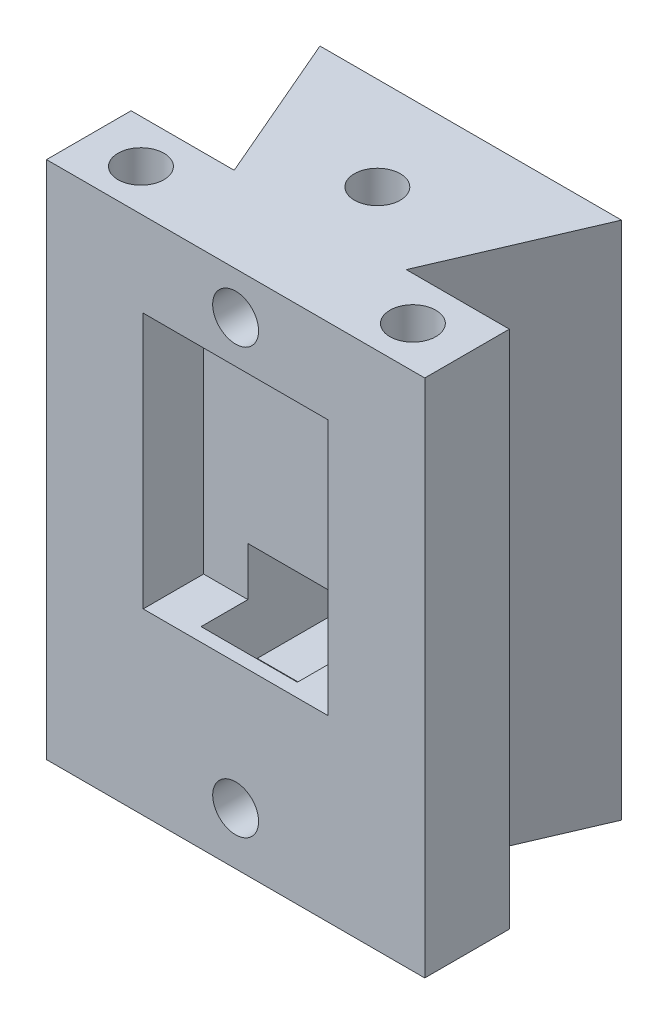
ISO-10303-21;
HEADER;
FILE_DESCRIPTION(('STEP AP214'),'2;1');
FILE_NAME('part.step','',(''),(''),'','','');
FILE_SCHEMA(('AUTOMOTIVE_DESIGN { 1 0 10303 214 1 1 1 1 }'));
ENDSEC;
DATA;
#1=APPLICATION_CONTEXT('core data for automotive mechanical design processes');
#2=APPLICATION_PROTOCOL_DEFINITION('international standard','automotive_design',2000,#1);
#3=PRODUCT_CONTEXT('',#1,'mechanical');
#4=PRODUCT('Part','Part','',(#3));
#5=PRODUCT_RELATED_PRODUCT_CATEGORY('part','',(#4));
#6=PRODUCT_DEFINITION_FORMATION('','',#4);
#7=PRODUCT_DEFINITION_CONTEXT('part definition',#1,'design');
#8=PRODUCT_DEFINITION('design','',#6,#7);
#9=PRODUCT_DEFINITION_SHAPE('','',#8);
#10=(LENGTH_UNIT() NAMED_UNIT(*) SI_UNIT(.MILLI.,.METRE.));
#11=(NAMED_UNIT(*) PLANE_ANGLE_UNIT() SI_UNIT($,.RADIAN.));
#12=(NAMED_UNIT(*) SI_UNIT($,.STERADIAN.) SOLID_ANGLE_UNIT());
#13=UNCERTAINTY_MEASURE_WITH_UNIT(LENGTH_MEASURE(1.E-05),#10,'distance_accuracy_value','');
#14=(GEOMETRIC_REPRESENTATION_CONTEXT(3) GLOBAL_UNCERTAINTY_ASSIGNED_CONTEXT((#13)) GLOBAL_UNIT_ASSIGNED_CONTEXT((#10,
#11,#12)) REPRESENTATION_CONTEXT('',''));
#15=CARTESIAN_POINT('',(0.,0.,0.));
#16=DIRECTION('',(0.,0.,1.));
#17=DIRECTION('',(1.,0.,0.));
#18=AXIS2_PLACEMENT_3D('',#15,#16,#17);
#19=CARTESIAN_POINT('',(0.,0.,0.));
#20=DIRECTION('',(0.,0.,1.));
#21=DIRECTION('',(1.,0.,0.));
#22=AXIS2_PLACEMENT_3D('',#19,#20,#21);
#23=PLANE('',#22);
#24=DIRECTION('',(0.,-1.,0.));
#25=VECTOR('',#24,1.);
#26=CARTESIAN_POINT('',(7.11871400525226,45.4881350240815,0.));
#27=LINE('',#26,#25);
#28=CARTESIAN_POINT('',(7.11871400525227,17.6,0.));
#29=VERTEX_POINT('',#28);
#30=CARTESIAN_POINT('',(7.11871400525227,-25.4,0.));
#31=VERTEX_POINT('',#30);
#32=EDGE_CURVE('E276',#29,#31,#27,.T.);
#33=ORIENTED_EDGE('',*,*,#32,.F.);
#34=DIRECTION('',(-1.,0.,0.));
#35=VECTOR('',#34,1.);
#36=CARTESIAN_POINT('',(-15.65,17.6,0.));
#37=LINE('',#36,#35);
#38=CARTESIAN_POINT('',(15.65,17.6,0.));
#39=VERTEX_POINT('',#38);
#40=EDGE_CURVE('E197',#39,#29,#37,.T.);
#41=ORIENTED_EDGE('',*,*,#40,.F.);
#42=DIRECTION('',(0.,1.,0.));
#43=VECTOR('',#42,1.);
#44=CARTESIAN_POINT('',(15.65,17.6,0.));
#45=LINE('',#44,#43);
#46=CARTESIAN_POINT('',(15.65,-25.4,0.));
#47=VERTEX_POINT('',#46);
#48=EDGE_CURVE('E353',#47,#39,#45,.T.);
#49=ORIENTED_EDGE('',*,*,#48,.F.);
#50=DIRECTION('',(1.,0.,0.));
#51=VECTOR('',#50,1.);
#52=CARTESIAN_POINT('',(7.11871400525227,-25.4,0.));
#53=LINE('',#52,#51);
#54=EDGE_CURVE('E230',#31,#47,#53,.T.);
#55=ORIENTED_EDGE('',*,*,#54,.F.);
#56=EDGE_LOOP('',(#33,#41,#49,#55));
#57=FACE_BOUND('',#56,.T.);
#58=ADVANCED_FACE('F45',(#57),#23,.F.);
#59=CARTESIAN_POINT('',(0.,0.,7.));
#60=DIRECTION('',(0.,0.,1.));
#61=DIRECTION('',(1.,0.,0.));
#62=AXIS2_PLACEMENT_3D('',#59,#60,#61);
#63=PLANE('',#62);
#64=CARTESIAN_POINT('',(0.,-21.0631013938427,7.));
#65=DIRECTION('',(0.,0.,1.));
#66=DIRECTION('',(1.,0.,0.));
#67=AXIS2_PLACEMENT_3D('',#64,#65,#66);
#68=CIRCLE('',#67,1.9);
#69=CARTESIAN_POINT('',(-1.89999999999999,-21.0631013938427,7.));
#70=VERTEX_POINT('',#69);
#71=EDGE_CURVE('E359',#70,#70,#68,.F.);
#72=ORIENTED_EDGE('',*,*,#71,.T.);
#73=EDGE_LOOP('',(#72));
#74=FACE_BOUND('',#73,.T.);
#75=CARTESIAN_POINT('',(0.,14.1,7.));
#76=DIRECTION('',(0.,0.,1.));
#77=DIRECTION('',(1.,0.,0.));
#78=AXIS2_PLACEMENT_3D('',#75,#76,#77);
#79=CIRCLE('',#78,1.9);
#80=CARTESIAN_POINT('',(1.9,14.1,7.));
#81=VERTEX_POINT('',#80);
#82=EDGE_CURVE('E262',#81,#81,#79,.T.);
#83=ORIENTED_EDGE('',*,*,#82,.F.);
#84=EDGE_LOOP('',(#83));
#85=FACE_BOUND('',#84,.T.);
#86=DIRECTION('',(0.,-1.,0.));
#87=VECTOR('',#86,1.);
#88=CARTESIAN_POINT('',(-15.65,17.6,7.));
#89=LINE('',#88,#87);
#90=CARTESIAN_POINT('',(-15.65,17.6,7.));
#91=VERTEX_POINT('',#90);
#92=CARTESIAN_POINT('',(-15.65,-25.4,7.));
#93=VERTEX_POINT('',#92);
#94=EDGE_CURVE('E185',#91,#93,#89,.T.);
#95=ORIENTED_EDGE('',*,*,#94,.T.);
#96=DIRECTION('',(-1.,0.,0.));
#97=VECTOR('',#96,1.);
#98=CARTESIAN_POINT('',(-15.65,-25.4,7.));
#99=LINE('',#98,#97);
#100=CARTESIAN_POINT('',(15.65,-25.4,7.));
#101=VERTEX_POINT('',#100);
#102=EDGE_CURVE('E190',#101,#93,#99,.T.);
#103=ORIENTED_EDGE('',*,*,#102,.F.);
#104=DIRECTION('',(0.,1.,0.));
#105=VECTOR('',#104,1.);
#106=CARTESIAN_POINT('',(15.65,17.6,7.));
#107=LINE('',#106,#105);
#108=CARTESIAN_POINT('',(15.65,17.6,7.));
#109=VERTEX_POINT('',#108);
#110=EDGE_CURVE('E196',#101,#109,#107,.T.);
#111=ORIENTED_EDGE('',*,*,#110,.T.);
#112=DIRECTION('',(-1.,0.,0.));
#113=VECTOR('',#112,1.);
#114=CARTESIAN_POINT('',(-15.65,17.6,7.));
#115=LINE('',#114,#113);
#116=EDGE_CURVE('E192',#109,#91,#115,.T.);
#117=ORIENTED_EDGE('',*,*,#116,.T.);
#118=EDGE_LOOP('',(#95,#103,#111,#117));
#119=FACE_BOUND('',#118,.T.);
#120=DIRECTION('',(-1.,0.,0.));
#121=VECTOR('',#120,1.);
#122=CARTESIAN_POINT('',(-7.65,10.6,7.));
#123=LINE('',#122,#121);
#124=CARTESIAN_POINT('',(7.65,10.6,7.));
#125=VERTEX_POINT('',#124);
#126=CARTESIAN_POINT('',(-7.65,10.6,7.));
#127=VERTEX_POINT('',#126);
#128=EDGE_CURVE('E330',#125,#127,#123,.T.);
#129=ORIENTED_EDGE('',*,*,#128,.F.);
#130=DIRECTION('',(0.,1.,0.));
#131=VECTOR('',#130,1.);
#132=CARTESIAN_POINT('',(7.65,10.6,7.));
#133=LINE('',#132,#131);
#134=CARTESIAN_POINT('',(7.65,-10.6,7.));
#135=VERTEX_POINT('',#134);
#136=EDGE_CURVE('E328',#135,#125,#133,.T.);
#137=ORIENTED_EDGE('',*,*,#136,.F.);
#138=DIRECTION('',(1.,0.,0.));
#139=VECTOR('',#138,1.);
#140=CARTESIAN_POINT('',(-7.65,-10.6,7.));
#141=LINE('',#140,#139);
#142=CARTESIAN_POINT('',(-7.65,-10.6,7.));
#143=VERTEX_POINT('',#142);
#144=EDGE_CURVE('E335',#143,#135,#141,.T.);
#145=ORIENTED_EDGE('',*,*,#144,.F.);
#146=DIRECTION('',(0.,-1.,0.));
#147=VECTOR('',#146,1.);
#148=CARTESIAN_POINT('',(-7.65,10.6,7.));
#149=LINE('',#148,#147);
#150=EDGE_CURVE('E332',#127,#143,#149,.T.);
#151=ORIENTED_EDGE('',*,*,#150,.F.);
#152=EDGE_LOOP('',(#129,#137,#145,#151));
#153=FACE_BOUND('',#152,.T.);
#154=ADVANCED_FACE('F187',(#74,#85,#119,#153),#63,.T.);
#155=CARTESIAN_POINT('',(-7.11871400525227,17.6,0.));
#156=VERTEX_POINT('',#155);
#157=CARTESIAN_POINT('',(-15.65,17.6,0.));
#158=VERTEX_POINT('',#157);
#159=EDGE_CURVE('E70',#156,#158,#37,.T.);
#160=ORIENTED_EDGE('',*,*,#159,.F.);
#161=DIRECTION('',(0.,-1.,0.));
#162=VECTOR('',#161,1.);
#163=CARTESIAN_POINT('',(-7.11871400525227,45.4881350240815,0.));
#164=LINE('',#163,#162);
#165=CARTESIAN_POINT('',(-7.11871400525227,-25.4,0.));
#166=VERTEX_POINT('',#165);
#167=EDGE_CURVE('E272',#156,#166,#164,.T.);
#168=ORIENTED_EDGE('',*,*,#167,.T.);
#169=DIRECTION('',(1.,0.,0.));
#170=VECTOR('',#169,1.);
#171=CARTESIAN_POINT('',(-15.65,-25.4,0.));
#172=LINE('',#171,#170);
#173=CARTESIAN_POINT('',(-15.65,-25.4,0.));
#174=VERTEX_POINT('',#173);
#175=EDGE_CURVE('E205',#174,#166,#172,.T.);
#176=ORIENTED_EDGE('',*,*,#175,.F.);
#177=DIRECTION('',(0.,-1.,0.));
#178=VECTOR('',#177,1.);
#179=CARTESIAN_POINT('',(-15.65,17.6,0.));
#180=LINE('',#179,#178);
#181=EDGE_CURVE('E201',#158,#174,#180,.T.);
#182=ORIENTED_EDGE('',*,*,#181,.F.);
#183=EDGE_LOOP('',(#160,#168,#176,#182));
#184=FACE_BOUND('',#183,.T.);
#185=ADVANCED_FACE('F413',(#184),#23,.F.);
#186=CARTESIAN_POINT('',(-15.65,17.6,7.));
#187=DIRECTION('',(1.,0.,0.));
#188=DIRECTION('',(0.,1.,0.));
#189=AXIS2_PLACEMENT_3D('',#186,#187,#188);
#190=PLANE('',#189);
#191=ORIENTED_EDGE('',*,*,#181,.T.);
#192=DIRECTION('',(0.,0.,-1.));
#193=VECTOR('',#192,1.);
#194=CARTESIAN_POINT('',(-15.65,-25.4,7.));
#195=LINE('',#194,#193);
#196=EDGE_CURVE('E200',#93,#174,#195,.T.);
#197=ORIENTED_EDGE('',*,*,#196,.F.);
#198=ORIENTED_EDGE('',*,*,#94,.F.);
#199=DIRECTION('',(0.,0.,-1.));
#200=VECTOR('',#199,1.);
#201=CARTESIAN_POINT('',(-15.65,17.6,7.));
#202=LINE('',#201,#200);
#203=EDGE_CURVE('E351',#91,#158,#202,.T.);
#204=ORIENTED_EDGE('',*,*,#203,.T.);
#205=EDGE_LOOP('',(#191,#197,#198,#204));
#206=FACE_BOUND('',#205,.T.);
#207=ADVANCED_FACE('F47',(#206),#190,.F.);
#208=CARTESIAN_POINT('',(15.65,17.6,7.));
#209=DIRECTION('',(-1.,0.,0.));
#210=DIRECTION('',(0.,-1.,0.));
#211=AXIS2_PLACEMENT_3D('',#208,#209,#210);
#212=PLANE('',#211);
#213=ORIENTED_EDGE('',*,*,#48,.T.);
#214=DIRECTION('',(0.,0.,-1.));
#215=VECTOR('',#214,1.);
#216=CARTESIAN_POINT('',(15.65,17.6,7.));
#217=LINE('',#216,#215);
#218=EDGE_CURVE('E54',#109,#39,#217,.T.);
#219=ORIENTED_EDGE('',*,*,#218,.F.);
#220=ORIENTED_EDGE('',*,*,#110,.F.);
#221=DIRECTION('',(0.,0.,1.));
#222=VECTOR('',#221,1.);
#223=CARTESIAN_POINT('',(15.65,-25.4,0.));
#224=LINE('',#223,#222);
#225=EDGE_CURVE('E212',#47,#101,#224,.T.);
#226=ORIENTED_EDGE('',*,*,#225,.F.);
#227=EDGE_LOOP('',(#213,#219,#220,#226));
#228=FACE_BOUND('',#227,.T.);
#229=ADVANCED_FACE('F424',(#228),#212,.F.);
#230=CARTESIAN_POINT('',(-15.65,17.6,7.));
#231=DIRECTION('',(0.,-1.,0.));
#232=DIRECTION('',(1.,0.,0.));
#233=AXIS2_PLACEMENT_3D('',#230,#231,#232);
#234=PLANE('',#233);
#235=CARTESIAN_POINT('',(0.,17.6,-4.72724866744241));
#236=DIRECTION('',(0.,-1.,0.));
#237=DIRECTION('',(1.,0.,0.));
#238=AXIS2_PLACEMENT_3D('',#235,#236,#237);
#239=CIRCLE('',#238,1.9);
#240=CARTESIAN_POINT('',(1.90000000000001,17.6,-4.72724866744241));
#241=VERTEX_POINT('',#240);
#242=EDGE_CURVE('E376',#241,#241,#239,.T.);
#243=ORIENTED_EDGE('',*,*,#242,.T.);
#244=EDGE_LOOP('',(#243));
#245=FACE_BOUND('',#244,.T.);
#246=CARTESIAN_POINT('',(-11.25,17.6,3.58335785592832));
#247=DIRECTION('',(0.,-1.,0.));
#248=DIRECTION('',(1.,0.,0.));
#249=AXIS2_PLACEMENT_3D('',#246,#247,#248);
#250=CIRCLE('',#249,1.9);
#251=CARTESIAN_POINT('',(-9.35,17.6,3.58335785592832));
#252=VERTEX_POINT('',#251);
#253=EDGE_CURVE('E283',#252,#252,#250,.T.);
#254=ORIENTED_EDGE('',*,*,#253,.T.);
#255=EDGE_LOOP('',(#254));
#256=FACE_BOUND('',#255,.T.);
#257=CARTESIAN_POINT('',(11.25,17.6,3.58335785592832));
#258=DIRECTION('',(0.,-1.,0.));
#259=DIRECTION('',(-1.,0.,0.));
#260=AXIS2_PLACEMENT_3D('',#257,#258,#259);
#261=CIRCLE('',#260,1.9);
#262=CARTESIAN_POINT('',(9.35,17.6,3.58335785592832));
#263=VERTEX_POINT('',#262);
#264=EDGE_CURVE('E282',#263,#263,#261,.T.);
#265=ORIENTED_EDGE('',*,*,#264,.T.);
#266=EDGE_LOOP('',(#265));
#267=FACE_BOUND('',#266,.T.);
#268=ORIENTED_EDGE('',*,*,#40,.T.);
#269=DIRECTION('',(0.3951913076483,0.,-0.918598840821839));
#270=VECTOR('',#269,1.);
#271=CARTESIAN_POINT('',(12.4764829671,17.6,-12.4538173347795));
#272=LINE('',#271,#270);
#273=CARTESIAN_POINT('',(12.4764829671,17.6,-12.4538173347795));
#274=VERTEX_POINT('',#273);
#275=EDGE_CURVE('E269',#29,#274,#272,.T.);
#276=ORIENTED_EDGE('',*,*,#275,.T.);
#277=DIRECTION('',(-1.,0.,0.));
#278=VECTOR('',#277,1.);
#279=CARTESIAN_POINT('',(-12.4764829671,17.6,-12.4538173347795));
#280=LINE('',#279,#278);
#281=CARTESIAN_POINT('',(-12.4764829671,17.6,-12.4538173347795));
#282=VERTEX_POINT('',#281);
#283=EDGE_CURVE('E274',#274,#282,#280,.T.);
#284=ORIENTED_EDGE('',*,*,#283,.T.);
#285=DIRECTION('',(0.3951913076483,0.,0.918598840821839));
#286=VECTOR('',#285,1.);
#287=CARTESIAN_POINT('',(-7.11871400525227,17.6,0.));
#288=LINE('',#287,#286);
#289=EDGE_CURVE('E271',#282,#156,#288,.T.);
#290=ORIENTED_EDGE('',*,*,#289,.T.);
#291=ORIENTED_EDGE('',*,*,#159,.T.);
#292=ORIENTED_EDGE('',*,*,#203,.F.);
#293=ORIENTED_EDGE('',*,*,#116,.F.);
#294=ORIENTED_EDGE('',*,*,#218,.T.);
#295=EDGE_LOOP('',(#268,#276,#284,#290,#291,#292,#293,#294));
#296=FACE_BOUND('',#295,.T.);
#297=ADVANCED_FACE('F428',(#245,#256,#267,#296),#234,.F.);
#298=CARTESIAN_POINT('',(7.65,10.6,7.));
#299=DIRECTION('',(-1.,0.,0.));
#300=DIRECTION('',(0.,-1.,0.));
#301=AXIS2_PLACEMENT_3D('',#298,#299,#300);
#302=PLANE('',#301);
#303=DIRECTION('',(0.,-1.,0.));
#304=VECTOR('',#303,1.);
#305=CARTESIAN_POINT('',(7.65,0.,2.));
#306=LINE('',#305,#304);
#307=CARTESIAN_POINT('',(7.65,10.6,2.));
#308=VERTEX_POINT('',#307);
#309=CARTESIAN_POINT('',(7.65,-10.6,2.));
#310=VERTEX_POINT('',#309);
#311=EDGE_CURVE('E316',#308,#310,#306,.T.);
#312=ORIENTED_EDGE('',*,*,#311,.T.);
#313=DIRECTION('',(0.,0.,-1.));
#314=VECTOR('',#313,1.);
#315=CARTESIAN_POINT('',(7.65,-10.6,7.));
#316=LINE('',#315,#314);
#317=EDGE_CURVE('E337',#135,#310,#316,.T.);
#318=ORIENTED_EDGE('',*,*,#317,.F.);
#319=ORIENTED_EDGE('',*,*,#136,.T.);
#320=DIRECTION('',(0.,0.,-1.));
#321=VECTOR('',#320,1.);
#322=CARTESIAN_POINT('',(7.65,10.6,7.));
#323=LINE('',#322,#321);
#324=EDGE_CURVE('E346',#125,#308,#323,.T.);
#325=ORIENTED_EDGE('',*,*,#324,.T.);
#326=EDGE_LOOP('',(#312,#318,#319,#325));
#327=FACE_BOUND('',#326,.T.);
#328=ADVANCED_FACE('F434',(#327),#302,.T.);
#329=CARTESIAN_POINT('',(-7.65,10.6,7.));
#330=DIRECTION('',(0.,-1.,0.));
#331=DIRECTION('',(0.,0.,-1.));
#332=AXIS2_PLACEMENT_3D('',#329,#330,#331);
#333=PLANE('',#332);
#334=DIRECTION('',(1.,0.,0.));
#335=VECTOR('',#334,1.);
#336=CARTESIAN_POINT('',(0.,10.6,2.));
#337=LINE('',#336,#335);
#338=CARTESIAN_POINT('',(-7.65,10.6,2.));
#339=VERTEX_POINT('',#338);
#340=EDGE_CURVE('E319',#339,#308,#337,.T.);
#341=ORIENTED_EDGE('',*,*,#340,.T.);
#342=ORIENTED_EDGE('',*,*,#324,.F.);
#343=ORIENTED_EDGE('',*,*,#128,.T.);
#344=DIRECTION('',(0.,0.,-1.));
#345=VECTOR('',#344,1.);
#346=CARTESIAN_POINT('',(-7.65,10.6,7.));
#347=LINE('',#346,#345);
#348=EDGE_CURVE('E343',#127,#339,#347,.T.);
#349=ORIENTED_EDGE('',*,*,#348,.T.);
#350=EDGE_LOOP('',(#341,#342,#343,#349));
#351=FACE_BOUND('',#350,.T.);
#352=ADVANCED_FACE('F527',(#351),#333,.T.);
#353=CARTESIAN_POINT('',(-7.65,10.6,7.));
#354=DIRECTION('',(1.,0.,0.));
#355=DIRECTION('',(0.,1.,0.));
#356=AXIS2_PLACEMENT_3D('',#353,#354,#355);
#357=PLANE('',#356);
#358=DIRECTION('',(0.,-1.,0.));
#359=VECTOR('',#358,1.);
#360=CARTESIAN_POINT('',(-7.65,0.,2.));
#361=LINE('',#360,#359);
#362=CARTESIAN_POINT('',(-7.65,-10.6,2.));
#363=VERTEX_POINT('',#362);
#364=EDGE_CURVE('E321',#339,#363,#361,.T.);
#365=ORIENTED_EDGE('',*,*,#364,.F.);
#366=ORIENTED_EDGE('',*,*,#348,.F.);
#367=ORIENTED_EDGE('',*,*,#150,.T.);
#368=DIRECTION('',(0.,0.,-1.));
#369=VECTOR('',#368,1.);
#370=CARTESIAN_POINT('',(-7.65,-10.6,7.));
#371=LINE('',#370,#369);
#372=EDGE_CURVE('E340',#143,#363,#371,.T.);
#373=ORIENTED_EDGE('',*,*,#372,.T.);
#374=EDGE_LOOP('',(#365,#366,#367,#373));
#375=FACE_BOUND('',#374,.T.);
#376=ADVANCED_FACE('F532',(#375),#357,.T.);
#377=CARTESIAN_POINT('',(-7.65,-10.6,7.));
#378=DIRECTION('',(0.,1.,0.));
#379=DIRECTION('',(0.,0.,1.));
#380=AXIS2_PLACEMENT_3D('',#377,#378,#379);
#381=PLANE('',#380);
#382=DIRECTION('',(0.,0.,1.));
#383=VECTOR('',#382,1.);
#384=CARTESIAN_POINT('',(-3.9855117917816,-10.6,1.22392079916793));
#385=LINE('',#384,#383);
#386=CARTESIAN_POINT('',(-3.9855117917816,-10.6,2.));
#387=VERTEX_POINT('',#386);
#388=CARTESIAN_POINT('',(-3.9855117917816,-10.6,5.87257780316096));
#389=VERTEX_POINT('',#388);
#390=EDGE_CURVE('E286',#387,#389,#385,.T.);
#391=ORIENTED_EDGE('',*,*,#390,.F.);
#392=DIRECTION('',(1.,0.,0.));
#393=VECTOR('',#392,1.);
#394=CARTESIAN_POINT('',(0.,-10.6,2.));
#395=LINE('',#394,#393);
#396=EDGE_CURVE('E325',#363,#387,#395,.T.);
#397=ORIENTED_EDGE('',*,*,#396,.F.);
#398=ORIENTED_EDGE('',*,*,#372,.F.);
#399=ORIENTED_EDGE('',*,*,#144,.T.);
#400=ORIENTED_EDGE('',*,*,#317,.T.);
#401=CARTESIAN_POINT('',(3.9855117917816,-10.6,2.));
#402=VERTEX_POINT('',#401);
#403=EDGE_CURVE('E324',#402,#310,#395,.T.);
#404=ORIENTED_EDGE('',*,*,#403,.F.);
#405=DIRECTION('',(0.,0.,-1.));
#406=VECTOR('',#405,1.);
#407=CARTESIAN_POINT('',(3.9855117917816,-10.6,1.22392079916793));
#408=LINE('',#407,#406);
#409=CARTESIAN_POINT('',(3.9855117917816,-10.6,5.87257780316096));
#410=VERTEX_POINT('',#409);
#411=EDGE_CURVE('E294',#410,#402,#408,.T.);
#412=ORIENTED_EDGE('',*,*,#411,.F.);
#413=DIRECTION('',(1.,0.,0.));
#414=VECTOR('',#413,1.);
#415=CARTESIAN_POINT('',(-3.9855117917816,-10.6,5.87257780316096));
#416=LINE('',#415,#414);
#417=EDGE_CURVE('E291',#389,#410,#416,.T.);
#418=ORIENTED_EDGE('',*,*,#417,.F.);
#419=EDGE_LOOP('',(#391,#397,#398,#399,#400,#404,#412,#418));
#420=FACE_BOUND('',#419,.T.);
#421=ADVANCED_FACE('F507',(#420),#381,.T.);
#422=CARTESIAN_POINT('',(0.,0.,2.));
#423=DIRECTION('',(0.,0.,1.));
#424=DIRECTION('',(1.,0.,0.));
#425=AXIS2_PLACEMENT_3D('',#422,#423,#424);
#426=PLANE('',#425);
#427=DIRECTION('',(0.,-1.,0.));
#428=VECTOR('',#427,1.);
#429=CARTESIAN_POINT('',(-3.9855117917816,-15.2006783387731,2.));
#430=LINE('',#429,#428);
#431=CARTESIAN_POINT('',(-3.9855117917816,-6.57673894372647,2.));
#432=VERTEX_POINT('',#431);
#433=EDGE_CURVE('E233',#432,#387,#430,.T.);
#434=ORIENTED_EDGE('',*,*,#433,.F.);
#435=DIRECTION('',(-1.,0.,0.));
#436=VECTOR('',#435,1.);
#437=CARTESIAN_POINT('',(-3.9855117917816,-6.57673894372647,2.));
#438=LINE('',#437,#436);
#439=CARTESIAN_POINT('',(3.9855117917816,-6.57673894372647,2.));
#440=VERTEX_POINT('',#439);
#441=EDGE_CURVE('E238',#440,#432,#438,.T.);
#442=ORIENTED_EDGE('',*,*,#441,.F.);
#443=DIRECTION('',(0.,1.,0.));
#444=VECTOR('',#443,1.);
#445=CARTESIAN_POINT('',(3.9855117917816,-15.2006783387731,2.));
#446=LINE('',#445,#444);
#447=EDGE_CURVE('E247',#402,#440,#446,.T.);
#448=ORIENTED_EDGE('',*,*,#447,.F.);
#449=ORIENTED_EDGE('',*,*,#403,.T.);
#450=ORIENTED_EDGE('',*,*,#311,.F.);
#451=ORIENTED_EDGE('',*,*,#340,.F.);
#452=ORIENTED_EDGE('',*,*,#364,.T.);
#453=ORIENTED_EDGE('',*,*,#396,.T.);
#454=EDGE_LOOP('',(#434,#442,#448,#449,#450,#451,#452,#453));
#455=FACE_BOUND('',#454,.T.);
#456=ADVANCED_FACE('F500',(#455),#426,.T.);
#457=CARTESIAN_POINT('',(-3.9855117917816,-17.6,1.22392079916793));
#458=DIRECTION('',(0.,0.,-1.));
#459=DIRECTION('',(-1.,0.,0.));
#460=AXIS2_PLACEMENT_3D('',#457,#458,#459);
#461=PLANE('',#460);
#462=DIRECTION('',(0.,1.,0.));
#463=VECTOR('',#462,1.);
#464=CARTESIAN_POINT('',(3.9855117917816,-17.6,1.22392079916793));
#465=LINE('',#464,#463);
#466=CARTESIAN_POINT('',(3.9855117917816,-16.6,1.22392079916793));
#467=VERTEX_POINT('',#466);
#468=CARTESIAN_POINT('',(3.9855117917816,-15.2006783387731,1.22392079916793));
#469=VERTEX_POINT('',#468);
#470=EDGE_CURVE('E302',#467,#469,#465,.T.);
#471=ORIENTED_EDGE('',*,*,#470,.T.);
#472=DIRECTION('',(-1.,0.,0.));
#473=VECTOR('',#472,1.);
#474=CARTESIAN_POINT('',(-3.9855117917816,-15.2006783387731,1.22392079916793));
#475=LINE('',#474,#473);
#476=CARTESIAN_POINT('',(-3.9855117917816,-15.2006783387731,1.22392079916793));
#477=VERTEX_POINT('',#476);
#478=EDGE_CURVE('E253',#469,#477,#475,.T.);
#479=ORIENTED_EDGE('',*,*,#478,.T.);
#480=DIRECTION('',(0.,1.,0.));
#481=VECTOR('',#480,1.);
#482=CARTESIAN_POINT('',(-3.9855117917816,-17.6,1.22392079916793));
#483=LINE('',#482,#481);
#484=CARTESIAN_POINT('',(-3.9855117917816,-16.6,1.22392079916793));
#485=VERTEX_POINT('',#484);
#486=EDGE_CURVE('E298',#485,#477,#483,.T.);
#487=ORIENTED_EDGE('',*,*,#486,.F.);
#488=DIRECTION('',(-1.,0.,0.));
#489=VECTOR('',#488,1.);
#490=CARTESIAN_POINT('',(-15.65,-16.6,1.22392079916793));
#491=LINE('',#490,#489);
#492=EDGE_CURVE('E12',#467,#485,#491,.T.);
#493=ORIENTED_EDGE('',*,*,#492,.F.);
#494=EDGE_LOOP('',(#471,#479,#487,#493));
#495=FACE_BOUND('',#494,.T.);
#496=ADVANCED_FACE('F515',(#495),#461,.F.);
#497=CARTESIAN_POINT('',(-3.9855117917816,-17.6,1.22392079916793));
#498=DIRECTION('',(-1.,0.,0.));
#499=DIRECTION('',(0.,0.,1.));
#500=AXIS2_PLACEMENT_3D('',#497,#498,#499);
#501=PLANE('',#500);
#502=ORIENTED_EDGE('',*,*,#486,.T.);
#503=DIRECTION('',(0.,0.,1.));
#504=VECTOR('',#503,1.);
#505=CARTESIAN_POINT('',(-3.9855117917816,-15.2006783387731,-12.4538173347795));
#506=LINE('',#505,#504);
#507=CARTESIAN_POINT('',(-3.9855117917816,-15.2006783387731,-12.4538173347795));
#508=VERTEX_POINT('',#507);
#509=EDGE_CURVE('E245',#508,#477,#506,.T.);
#510=ORIENTED_EDGE('',*,*,#509,.F.);
#511=DIRECTION('',(0.,-1.,0.));
#512=VECTOR('',#511,1.);
#513=CARTESIAN_POINT('',(-3.9855117917816,-15.2006783387731,-12.4538173347795));
#514=LINE('',#513,#512);
#515=CARTESIAN_POINT('',(-3.9855117917816,-6.57673894372647,-12.4538173347795));
#516=VERTEX_POINT('',#515);
#517=EDGE_CURVE('E234',#516,#508,#514,.T.);
#518=ORIENTED_EDGE('',*,*,#517,.F.);
#519=DIRECTION('',(0.,0.,1.));
#520=VECTOR('',#519,1.);
#521=CARTESIAN_POINT('',(-3.9855117917816,-6.57673894372647,-12.4538173347795));
#522=LINE('',#521,#520);
#523=EDGE_CURVE('E251',#516,#432,#522,.T.);
#524=ORIENTED_EDGE('',*,*,#523,.T.);
#525=ORIENTED_EDGE('',*,*,#433,.T.);
#526=ORIENTED_EDGE('',*,*,#390,.T.);
#527=DIRECTION('',(0.,1.,0.));
#528=VECTOR('',#527,1.);
#529=CARTESIAN_POINT('',(-3.9855117917816,-17.6,5.87257780316096));
#530=LINE('',#529,#528);
#531=CARTESIAN_POINT('',(-3.9855117917816,-16.6,5.87257780316096));
#532=VERTEX_POINT('',#531);
#533=EDGE_CURVE('E297',#532,#389,#530,.T.);
#534=ORIENTED_EDGE('',*,*,#533,.F.);
#535=DIRECTION('',(0.,0.,1.));
#536=VECTOR('',#535,1.);
#537=CARTESIAN_POINT('',(-3.9855117917816,-16.6,7.));
#538=LINE('',#537,#536);
#539=EDGE_CURVE('E313',#485,#532,#538,.T.);
#540=ORIENTED_EDGE('',*,*,#539,.F.);
#541=EDGE_LOOP('',(#502,#510,#518,#524,#525,#526,#534,#540));
#542=FACE_BOUND('',#541,.T.);
#543=ADVANCED_FACE('F503',(#542),#501,.F.);
#544=CARTESIAN_POINT('',(3.9855117917816,-17.6,1.22392079916793));
#545=DIRECTION('',(1.,0.,0.));
#546=DIRECTION('',(0.,0.,-1.));
#547=AXIS2_PLACEMENT_3D('',#544,#545,#546);
#548=PLANE('',#547);
#549=DIRECTION('',(0.,0.,1.));
#550=VECTOR('',#549,1.);
#551=CARTESIAN_POINT('',(3.9855117917816,-15.2006783387731,-12.4538173347795));
#552=LINE('',#551,#550);
#553=CARTESIAN_POINT('',(3.9855117917816,-15.2006783387731,-12.4538173347795));
#554=VERTEX_POINT('',#553);
#555=EDGE_CURVE('E257',#554,#469,#552,.T.);
#556=ORIENTED_EDGE('',*,*,#555,.T.);
#557=ORIENTED_EDGE('',*,*,#470,.F.);
#558=DIRECTION('',(0.,0.,-1.));
#559=VECTOR('',#558,1.);
#560=CARTESIAN_POINT('',(3.9855117917816,-16.6,7.));
#561=LINE('',#560,#559);
#562=CARTESIAN_POINT('',(3.9855117917816,-16.6,5.87257780316096));
#563=VERTEX_POINT('',#562);
#564=EDGE_CURVE('E310',#563,#467,#561,.T.);
#565=ORIENTED_EDGE('',*,*,#564,.F.);
#566=DIRECTION('',(0.,1.,0.));
#567=VECTOR('',#566,1.);
#568=CARTESIAN_POINT('',(3.9855117917816,-17.6,5.87257780316096));
#569=LINE('',#568,#567);
#570=EDGE_CURVE('E305',#563,#410,#569,.T.);
#571=ORIENTED_EDGE('',*,*,#570,.T.);
#572=ORIENTED_EDGE('',*,*,#411,.T.);
#573=ORIENTED_EDGE('',*,*,#447,.T.);
#574=DIRECTION('',(0.,0.,1.));
#575=VECTOR('',#574,1.);
#576=CARTESIAN_POINT('',(3.9855117917816,-6.57673894372647,-12.4538173347795));
#577=LINE('',#576,#575);
#578=CARTESIAN_POINT('',(3.9855117917816,-6.57673894372647,-12.4538173347795));
#579=VERTEX_POINT('',#578);
#580=EDGE_CURVE('E254',#579,#440,#577,.T.);
#581=ORIENTED_EDGE('',*,*,#580,.F.);
#582=DIRECTION('',(0.,1.,0.));
#583=VECTOR('',#582,1.);
#584=CARTESIAN_POINT('',(3.9855117917816,-15.2006783387731,-12.4538173347795));
#585=LINE('',#584,#583);
#586=EDGE_CURVE('E62',#554,#579,#585,.T.);
#587=ORIENTED_EDGE('',*,*,#586,.F.);
#588=EDGE_LOOP('',(#556,#557,#565,#571,#572,#573,#581,#587));
#589=FACE_BOUND('',#588,.T.);
#590=ADVANCED_FACE('F518',(#589),#548,.F.);
#591=CARTESIAN_POINT('',(-3.9855117917816,-17.6,5.87257780316096));
#592=DIRECTION('',(0.,0.,1.));
#593=DIRECTION('',(1.,0.,0.));
#594=AXIS2_PLACEMENT_3D('',#591,#592,#593);
#595=PLANE('',#594);
#596=ORIENTED_EDGE('',*,*,#533,.T.);
#597=ORIENTED_EDGE('',*,*,#417,.T.);
#598=ORIENTED_EDGE('',*,*,#570,.F.);
#599=DIRECTION('',(1.,0.,0.));
#600=VECTOR('',#599,1.);
#601=CARTESIAN_POINT('',(-15.65,-16.6,5.87257780316096));
#602=LINE('',#601,#600);
#603=EDGE_CURVE('E301',#532,#563,#602,.T.);
#604=ORIENTED_EDGE('',*,*,#603,.F.);
#605=EDGE_LOOP('',(#596,#597,#598,#604));
#606=FACE_BOUND('',#605,.T.);
#607=ADVANCED_FACE('F406',(#606),#595,.F.);
#608=CARTESIAN_POINT('',(11.25,17.6,3.58335785592832));
#609=DIRECTION('',(0.,-1.,0.));
#610=DIRECTION('',(1.,0.,0.));
#611=AXIS2_PLACEMENT_3D('',#608,#609,#610);
#612=CYLINDRICAL_SURFACE('',#611,1.9);
#613=ORIENTED_EDGE('',*,*,#264,.F.);
#614=EDGE_LOOP('',(#613));
#615=FACE_BOUND('',#614,.T.);
#616=CARTESIAN_POINT('',(11.25,-25.4,3.58335785592832));
#617=DIRECTION('',(0.,-1.,0.));
#618=DIRECTION('',(1.,0.,0.));
#619=AXIS2_PLACEMENT_3D('',#616,#617,#618);
#620=CIRCLE('',#619,1.9);
#621=CARTESIAN_POINT('',(13.15,-25.4,3.58335785592832));
#622=VERTEX_POINT('',#621);
#623=EDGE_CURVE('E216',#622,#622,#620,.T.);
#624=ORIENTED_EDGE('',*,*,#623,.T.);
#625=EDGE_LOOP('',(#624));
#626=FACE_BOUND('',#625,.T.);
#627=ADVANCED_FACE('F396',(#615,#626),#612,.F.);
#628=CARTESIAN_POINT('',(-11.25,17.6,3.58335785592832));
#629=DIRECTION('',(0.,-1.,0.));
#630=DIRECTION('',(1.,0.,0.));
#631=AXIS2_PLACEMENT_3D('',#628,#629,#630);
#632=CYLINDRICAL_SURFACE('',#631,1.9);
#633=ORIENTED_EDGE('',*,*,#253,.F.);
#634=EDGE_LOOP('',(#633));
#635=FACE_BOUND('',#634,.T.);
#636=CARTESIAN_POINT('',(-11.25,-25.4,3.58335785592832));
#637=DIRECTION('',(0.,-1.,0.));
#638=DIRECTION('',(1.,0.,0.));
#639=AXIS2_PLACEMENT_3D('',#636,#637,#638);
#640=CIRCLE('',#639,1.9);
#641=CARTESIAN_POINT('',(-9.35,-25.4,3.58335785592832));
#642=VERTEX_POINT('',#641);
#643=EDGE_CURVE('E213',#642,#642,#640,.T.);
#644=ORIENTED_EDGE('',*,*,#643,.T.);
#645=EDGE_LOOP('',(#644));
#646=FACE_BOUND('',#645,.T.);
#647=ADVANCED_FACE('F393',(#635,#646),#632,.F.);
#648=CARTESIAN_POINT('',(-7.11871400525227,45.4881350240815,0.));
#649=DIRECTION('',(-0.918598840821839,0.,0.3951913076483));
#650=DIRECTION('',(0.3951913076483,0.,0.918598840821839));
#651=AXIS2_PLACEMENT_3D('',#648,#649,#650);
#652=PLANE('',#651);
#653=ORIENTED_EDGE('',*,*,#289,.F.);
#654=DIRECTION('',(0.,-1.,0.));
#655=VECTOR('',#654,1.);
#656=CARTESIAN_POINT('',(-12.4764829671,45.4881350240815,-12.4538173347795));
#657=LINE('',#656,#655);
#658=CARTESIAN_POINT('',(-12.4764829671,-25.4,-12.4538173347795));
#659=VERTEX_POINT('',#658);
#660=EDGE_CURVE('E266',#282,#659,#657,.T.);
#661=ORIENTED_EDGE('',*,*,#660,.T.);
#662=DIRECTION('',(-0.3951913076483,0.,-0.918598840821839));
#663=VECTOR('',#662,1.);
#664=CARTESIAN_POINT('',(-7.11871400525227,-25.4,0.));
#665=LINE('',#664,#663);
#666=EDGE_CURVE('E221',#166,#659,#665,.T.);
#667=ORIENTED_EDGE('',*,*,#666,.F.);
#668=ORIENTED_EDGE('',*,*,#167,.F.);
#669=EDGE_LOOP('',(#653,#661,#667,#668));
#670=FACE_BOUND('',#669,.T.);
#671=ADVANCED_FACE('F395',(#670),#652,.T.);
#672=CARTESIAN_POINT('',(12.4764829671,45.4881350240815,-12.4538173347795));
#673=DIRECTION('',(0.918598840821839,0.,0.3951913076483));
#674=DIRECTION('',(0.3951913076483,0.,-0.918598840821839));
#675=AXIS2_PLACEMENT_3D('',#672,#673,#674);
#676=PLANE('',#675);
#677=ORIENTED_EDGE('',*,*,#275,.F.);
#678=ORIENTED_EDGE('',*,*,#32,.T.);
#679=DIRECTION('',(-0.3951913076483,0.,0.918598840821839));
#680=VECTOR('',#679,1.);
#681=CARTESIAN_POINT('',(12.4764829671,-25.4,-12.4538173347795));
#682=LINE('',#681,#680);
#683=CARTESIAN_POINT('',(12.4764829671,-25.4,-12.4538173347795));
#684=VERTEX_POINT('',#683);
#685=EDGE_CURVE('E227',#684,#31,#682,.T.);
#686=ORIENTED_EDGE('',*,*,#685,.F.);
#687=DIRECTION('',(0.,-1.,0.));
#688=VECTOR('',#687,1.);
#689=CARTESIAN_POINT('',(12.4764829671,45.4881350240815,-12.4538173347795));
#690=LINE('',#689,#688);
#691=EDGE_CURVE('E278',#274,#684,#690,.T.);
#692=ORIENTED_EDGE('',*,*,#691,.F.);
#693=EDGE_LOOP('',(#677,#678,#686,#692));
#694=FACE_BOUND('',#693,.T.);
#695=ADVANCED_FACE('F403',(#694),#676,.T.);
#696=CARTESIAN_POINT('',(-12.4764829671,45.4881350240815,-12.4538173347795));
#697=DIRECTION('',(0.,0.,-1.));
#698=DIRECTION('',(-1.,0.,0.));
#699=AXIS2_PLACEMENT_3D('',#696,#697,#698);
#700=PLANE('',#699);
#701=ORIENTED_EDGE('',*,*,#517,.T.);
#702=DIRECTION('',(1.,0.,0.));
#703=VECTOR('',#702,1.);
#704=CARTESIAN_POINT('',(-3.9855117917816,-15.2006783387731,-12.4538173347795));
#705=LINE('',#704,#703);
#706=EDGE_CURVE('E237',#508,#554,#705,.T.);
#707=ORIENTED_EDGE('',*,*,#706,.T.);
#708=ORIENTED_EDGE('',*,*,#586,.T.);
#709=DIRECTION('',(-1.,0.,0.));
#710=VECTOR('',#709,1.);
#711=CARTESIAN_POINT('',(-3.9855117917816,-6.57673894372647,-12.4538173347795));
#712=LINE('',#711,#710);
#713=EDGE_CURVE('E242',#579,#516,#712,.T.);
#714=ORIENTED_EDGE('',*,*,#713,.T.);
#715=EDGE_LOOP('',(#701,#707,#708,#714));
#716=FACE_BOUND('',#715,.T.);
#717=ORIENTED_EDGE('',*,*,#283,.F.);
#718=ORIENTED_EDGE('',*,*,#691,.T.);
#719=DIRECTION('',(1.,0.,0.));
#720=VECTOR('',#719,1.);
#721=CARTESIAN_POINT('',(-12.4764829671,-25.4,-12.4538173347795));
#722=LINE('',#721,#720);
#723=EDGE_CURVE('E224',#659,#684,#722,.T.);
#724=ORIENTED_EDGE('',*,*,#723,.F.);
#725=ORIENTED_EDGE('',*,*,#660,.F.);
#726=EDGE_LOOP('',(#717,#718,#724,#725));
#727=FACE_BOUND('',#726,.T.);
#728=ADVANCED_FACE('F448',(#716,#727),#700,.T.);
#729=CARTESIAN_POINT('',(0.,14.1,1.));
#730=DIRECTION('',(0.,0.,1.));
#731=DIRECTION('',(1.,0.,0.));
#732=AXIS2_PLACEMENT_3D('',#729,#730,#731);
#733=CYLINDRICAL_SURFACE('',#732,1.9);
#734=CARTESIAN_POINT('',(0.,14.1,1.));
#735=DIRECTION('',(0.,0.,1.));
#736=DIRECTION('',(1.,0.,0.));
#737=AXIS2_PLACEMENT_3D('',#734,#735,#736);
#738=CIRCLE('',#737,1.9);
#739=CARTESIAN_POINT('',(1.9,14.1,1.));
#740=VERTEX_POINT('',#739);
#741=EDGE_CURVE('E263',#740,#740,#738,.T.);
#742=ORIENTED_EDGE('',*,*,#741,.F.);
#743=EDGE_LOOP('',(#742));
#744=FACE_BOUND('',#743,.T.);
#745=ORIENTED_EDGE('',*,*,#82,.T.);
#746=EDGE_LOOP('',(#745));
#747=FACE_BOUND('',#746,.T.);
#748=ADVANCED_FACE('F452',(#744,#747),#733,.F.);
#749=CARTESIAN_POINT('',(0.,14.1,1.));
#750=DIRECTION('',(0.,0.,1.));
#751=DIRECTION('',(1.,0.,0.));
#752=AXIS2_PLACEMENT_3D('',#749,#750,#751);
#753=PLANE('',#752);
#754=ORIENTED_EDGE('',*,*,#741,.T.);
#755=EDGE_LOOP('',(#754));
#756=FACE_BOUND('',#755,.T.);
#757=ADVANCED_FACE('F460',(#756),#753,.T.);
#758=CARTESIAN_POINT('',(-3.9855117917816,-15.2006783387731,-12.4538173347795));
#759=DIRECTION('',(0.,-1.,0.));
#760=DIRECTION('',(1.,0.,0.));
#761=AXIS2_PLACEMENT_3D('',#758,#759,#760);
#762=PLANE('',#761);
#763=CARTESIAN_POINT('',(0.,-15.2006783387731,-4.72724866744241));
#764=DIRECTION('',(0.,-1.,0.));
#765=DIRECTION('',(1.,0.,0.));
#766=AXIS2_PLACEMENT_3D('',#763,#764,#765);
#767=CIRCLE('',#766,1.9);
#768=CARTESIAN_POINT('',(1.90000000000002,-15.2006783387731,-4.72724866744241));
#769=VERTEX_POINT('',#768);
#770=EDGE_CURVE('E366',#769,#769,#767,.T.);
#771=ORIENTED_EDGE('',*,*,#770,.T.);
#772=EDGE_LOOP('',(#771));
#773=FACE_BOUND('',#772,.T.);
#774=ORIENTED_EDGE('',*,*,#555,.F.);
#775=ORIENTED_EDGE('',*,*,#706,.F.);
#776=ORIENTED_EDGE('',*,*,#509,.T.);
#777=ORIENTED_EDGE('',*,*,#478,.F.);
#778=EDGE_LOOP('',(#774,#775,#776,#777));
#779=FACE_BOUND('',#778,.T.);
#780=ADVANCED_FACE('F467',(#773,#779),#762,.F.);
#781=CARTESIAN_POINT('',(-3.9855117917816,-6.57673894372647,-12.4538173347795));
#782=DIRECTION('',(0.,1.,0.));
#783=DIRECTION('',(-1.,0.,0.));
#784=AXIS2_PLACEMENT_3D('',#781,#782,#783);
#785=PLANE('',#784);
#786=CARTESIAN_POINT('',(0.,-6.57673894372647,-4.72724866744241));
#787=DIRECTION('',(0.,1.,0.));
#788=DIRECTION('',(-1.,0.,0.));
#789=AXIS2_PLACEMENT_3D('',#786,#787,#788);
#790=CIRCLE('',#789,1.9);
#791=CARTESIAN_POINT('',(-1.89999999999998,-6.57673894372647,-4.72724866744241));
#792=VERTEX_POINT('',#791);
#793=EDGE_CURVE('E371',#792,#792,#790,.T.);
#794=ORIENTED_EDGE('',*,*,#793,.T.);
#795=EDGE_LOOP('',(#794));
#796=FACE_BOUND('',#795,.T.);
#797=ORIENTED_EDGE('',*,*,#441,.T.);
#798=ORIENTED_EDGE('',*,*,#523,.F.);
#799=ORIENTED_EDGE('',*,*,#713,.F.);
#800=ORIENTED_EDGE('',*,*,#580,.T.);
#801=EDGE_LOOP('',(#797,#798,#799,#800));
#802=FACE_BOUND('',#801,.T.);
#803=ADVANCED_FACE('F471',(#796,#802),#785,.F.);
#804=CARTESIAN_POINT('',(0.,-16.6,0.));
#805=DIRECTION('',(0.,-1.,0.));
#806=DIRECTION('',(1.,0.,0.));
#807=AXIS2_PLACEMENT_3D('',#804,#805,#806);
#808=PLANE('',#807);
#809=ORIENTED_EDGE('',*,*,#564,.T.);
#810=ORIENTED_EDGE('',*,*,#492,.T.);
#811=ORIENTED_EDGE('',*,*,#539,.T.);
#812=ORIENTED_EDGE('',*,*,#603,.T.);
#813=EDGE_LOOP('',(#809,#810,#811,#812));
#814=FACE_BOUND('',#813,.T.);
#815=ADVANCED_FACE('F389',(#814),#808,.F.);
#816=CARTESIAN_POINT('',(0.,-25.4,0.));
#817=DIRECTION('',(0.,-1.,0.));
#818=DIRECTION('',(1.,0.,0.));
#819=AXIS2_PLACEMENT_3D('',#816,#817,#818);
#820=PLANE('',#819);
#821=CARTESIAN_POINT('',(0.,-25.4,-4.72724866744241));
#822=DIRECTION('',(0.,-1.,0.));
#823=DIRECTION('',(1.,0.,0.));
#824=AXIS2_PLACEMENT_3D('',#821,#822,#823);
#825=CIRCLE('',#824,1.9);
#826=CARTESIAN_POINT('',(1.90000000000002,-25.4,-4.72724866744241));
#827=VERTEX_POINT('',#826);
#828=EDGE_CURVE('E49',#827,#827,#825,.T.);
#829=ORIENTED_EDGE('',*,*,#828,.F.);
#830=EDGE_LOOP('',(#829));
#831=FACE_BOUND('',#830,.T.);
#832=ORIENTED_EDGE('',*,*,#643,.F.);
#833=EDGE_LOOP('',(#832));
#834=FACE_BOUND('',#833,.T.);
#835=ORIENTED_EDGE('',*,*,#102,.T.);
#836=ORIENTED_EDGE('',*,*,#196,.T.);
#837=ORIENTED_EDGE('',*,*,#175,.T.);
#838=ORIENTED_EDGE('',*,*,#666,.T.);
#839=ORIENTED_EDGE('',*,*,#723,.T.);
#840=ORIENTED_EDGE('',*,*,#685,.T.);
#841=ORIENTED_EDGE('',*,*,#54,.T.);
#842=ORIENTED_EDGE('',*,*,#225,.T.);
#843=EDGE_LOOP('',(#835,#836,#837,#838,#839,#840,#841,#842));
#844=FACE_BOUND('',#843,.T.);
#845=ORIENTED_EDGE('',*,*,#623,.F.);
#846=EDGE_LOOP('',(#845));
#847=FACE_BOUND('',#846,.T.);
#848=ADVANCED_FACE('F208',(#831,#834,#844,#847),#820,.T.);
#849=CARTESIAN_POINT('',(0.,-21.0631013938427,7.000012));
#850=DIRECTION('',(0.,0.,-1.));
#851=DIRECTION('',(-1.,0.,0.));
#852=AXIS2_PLACEMENT_3D('',#849,#850,#851);
#853=CYLINDRICAL_SURFACE('',#852,1.9);
#854=CARTESIAN_POINT('',(0.,-21.0631013938427,-1.));
#855=DIRECTION('',(0.,0.,1.));
#856=DIRECTION('',(1.,0.,0.));
#857=AXIS2_PLACEMENT_3D('',#854,#855,#856);
#858=CIRCLE('',#857,1.9);
#859=CARTESIAN_POINT('',(-1.89999999999999,-21.0631013938427,-0.999999999999999));
#860=VERTEX_POINT('',#859);
#861=EDGE_CURVE('E361',#860,#860,#858,.T.);
#862=CARTESIAN_POINT('',(-1.89999999999999,-21.0631013938427,7.));
#863=CARTESIAN_POINT('',(-1.89999999999999,-21.0631013938427,6.91666666666667));
#864=CARTESIAN_POINT('',(-1.89999999999999,-21.0631013938427,6.83333333333333));
#865=CARTESIAN_POINT('',(-1.89999999999999,-21.0631013938427,6.66666666666667));
#866=CARTESIAN_POINT('',(-1.89999999999999,-21.0631013938427,6.58333333333333));
#867=CARTESIAN_POINT('',(-1.89999999999999,-21.0631013938427,6.41666666666667));
#868=CARTESIAN_POINT('',(-1.89999999999999,-21.0631013938427,6.33333333333333));
#869=CARTESIAN_POINT('',(-1.89999999999999,-21.0631013938427,6.16666666666667));
#870=CARTESIAN_POINT('',(-1.89999999999999,-21.0631013938427,6.08333333333333));
#871=CARTESIAN_POINT('',(-1.89999999999999,-21.0631013938427,5.91666666666667));
#872=CARTESIAN_POINT('',(-1.89999999999999,-21.0631013938427,5.83333333333333));
#873=CARTESIAN_POINT('',(-1.89999999999999,-21.0631013938427,5.66666666666667));
#874=CARTESIAN_POINT('',(-1.89999999999999,-21.0631013938427,5.58333333333333));
#875=CARTESIAN_POINT('',(-1.89999999999999,-21.0631013938427,5.41666666666667));
#876=CARTESIAN_POINT('',(-1.89999999999999,-21.0631013938427,5.33333333333333));
#877=CARTESIAN_POINT('',(-1.89999999999999,-21.0631013938427,5.16666666666667));
#878=CARTESIAN_POINT('',(-1.89999999999999,-21.0631013938427,5.08333333333333));
#879=CARTESIAN_POINT('',(-1.89999999999999,-21.0631013938427,4.91666666666667));
#880=CARTESIAN_POINT('',(-1.89999999999999,-21.0631013938427,4.83333333333333));
#881=CARTESIAN_POINT('',(-1.89999999999999,-21.0631013938427,4.66666666666667));
#882=CARTESIAN_POINT('',(-1.89999999999999,-21.0631013938427,4.58333333333333));
#883=CARTESIAN_POINT('',(-1.89999999999999,-21.0631013938427,4.41666666666667));
#884=CARTESIAN_POINT('',(-1.89999999999999,-21.0631013938427,4.33333333333333));
#885=CARTESIAN_POINT('',(-1.89999999999999,-21.0631013938427,4.16666666666667));
#886=CARTESIAN_POINT('',(-1.89999999999999,-21.0631013938427,4.08333333333333));
#887=CARTESIAN_POINT('',(-1.89999999999999,-21.0631013938427,3.91666666666667));
#888=CARTESIAN_POINT('',(-1.89999999999999,-21.0631013938427,3.83333333333333));
#889=CARTESIAN_POINT('',(-1.89999999999999,-21.0631013938427,3.66666666666667));
#890=CARTESIAN_POINT('',(-1.89999999999999,-21.0631013938427,3.58333333333333));
#891=CARTESIAN_POINT('',(-1.89999999999999,-21.0631013938427,3.41666666666667));
#892=CARTESIAN_POINT('',(-1.89999999999999,-21.0631013938427,3.33333333333333));
#893=CARTESIAN_POINT('',(-1.89999999999999,-21.0631013938427,3.16666666666667));
#894=CARTESIAN_POINT('',(-1.89999999999999,-21.0631013938427,3.08333333333333));
#895=CARTESIAN_POINT('',(-1.89999999999999,-21.0631013938427,2.91666666666667));
#896=CARTESIAN_POINT('',(-1.89999999999999,-21.0631013938427,2.83333333333333));
#897=CARTESIAN_POINT('',(-1.89999999999999,-21.0631013938427,2.66666666666667));
#898=CARTESIAN_POINT('',(-1.89999999999999,-21.0631013938427,2.58333333333333));
#899=CARTESIAN_POINT('',(-1.89999999999999,-21.0631013938427,2.41666666666667));
#900=CARTESIAN_POINT('',(-1.89999999999999,-21.0631013938427,2.33333333333333));
#901=CARTESIAN_POINT('',(-1.89999999999999,-21.0631013938427,2.16666666666667));
#902=CARTESIAN_POINT('',(-1.89999999999999,-21.0631013938427,2.08333333333333));
#903=CARTESIAN_POINT('',(-1.89999999999999,-21.0631013938427,1.91666666666667));
#904=CARTESIAN_POINT('',(-1.89999999999999,-21.0631013938427,1.83333333333333));
#905=CARTESIAN_POINT('',(-1.89999999999999,-21.0631013938427,1.66666666666667));
#906=CARTESIAN_POINT('',(-1.89999999999999,-21.0631013938427,1.58333333333333));
#907=CARTESIAN_POINT('',(-1.89999999999999,-21.0631013938427,1.41666666666667));
#908=CARTESIAN_POINT('',(-1.89999999999999,-21.0631013938427,1.33333333333333));
#909=CARTESIAN_POINT('',(-1.89999999999999,-21.0631013938427,1.16666666666667));
#910=CARTESIAN_POINT('',(-1.89999999999999,-21.0631013938427,1.08333333333333));
#911=CARTESIAN_POINT('',(-1.89999999999999,-21.0631013938427,0.916666666666667));
#912=CARTESIAN_POINT('',(-1.89999999999999,-21.0631013938427,0.833333333333333));
#913=CARTESIAN_POINT('',(-1.89999999999999,-21.0631013938427,0.666666666666666));
#914=CARTESIAN_POINT('',(-1.89999999999999,-21.0631013938427,0.583333333333333));
#915=CARTESIAN_POINT('',(-1.89999999999999,-21.0631013938427,0.416666666666667));
#916=CARTESIAN_POINT('',(-1.89999999999999,-21.0631013938427,0.333333333333334));
#917=CARTESIAN_POINT('',(-1.89999999999999,-21.0631013938427,0.166666666666668));
#918=CARTESIAN_POINT('',(-1.89999999999999,-21.0631013938427,0.0833333333333343));
#919=CARTESIAN_POINT('',(-1.89999999999999,-21.0631013938427,-0.0833333333333325));
#920=CARTESIAN_POINT('',(-1.89999999999999,-21.0631013938427,-0.166666666666666));
#921=CARTESIAN_POINT('',(-1.89999999999999,-21.0631013938427,-0.333333333333333));
#922=CARTESIAN_POINT('',(-1.89999999999999,-21.0631013938427,-0.416666666666666));
#923=CARTESIAN_POINT('',(-1.89999999999999,-21.0631013938427,-0.583333333333333));
#924=CARTESIAN_POINT('',(-1.89999999999999,-21.0631013938427,-0.666666666666666));
#925=CARTESIAN_POINT('',(-1.89999999999999,-21.0631013938427,-0.833333333333333));
#926=CARTESIAN_POINT('',(-1.89999999999999,-21.0631013938427,-0.916666666666666));
#927=CARTESIAN_POINT('',(-1.89999999999999,-21.0631013938427,-0.999999999999999));
#928=B_SPLINE_CURVE_WITH_KNOTS('',3,(#862,#863,#864,#865,#866,#867,#868,#869,#870,#871,#872,
#873,#874,#875,#876,#877,#878,#879,#880,#881,#882,#883,#884,#885,#886,#887,#888,#889,#890,#891,
#892,#893,#894,#895,#896,#897,#898,#899,#900,#901,#902,#903,#904,#905,#906,#907,#908,#909,#910,
#911,#912,#913,#914,#915,#916,#917,#918,#919,#920,#921,#922,#923,#924,#925,#926,#927),
.UNSPECIFIED.,.F.,.F.,(4,2,2,2,2,2,2,2,2,2,2,2,2,2,2,2,2,2,2,2,2,2,2,2,2,2,2,2,2,2,2,2,4),(0.,
0.25,0.5,0.750000000000001,1.,1.25,1.5,1.75,2.,2.25,2.5,2.75,3.,3.25,3.5,3.75,4.,4.25,4.5,4.75,
5.,5.25,5.5,5.75,6.,6.25,6.5,6.75,7.,7.25,7.5,7.75,8.),.UNSPECIFIED.);
#929=EDGE_CURVE('BSEAM388',#70,#860,#928,.T.);
#930=ORIENTED_EDGE('',*,*,#71,.F.);
#931=ORIENTED_EDGE('',*,*,#861,.F.);
#932=ORIENTED_EDGE('',*,*,#929,.T.);
#933=ORIENTED_EDGE('',*,*,#929,.F.);
#934=EDGE_LOOP('',(#930,#932,#931,#933));
#935=FACE_BOUND('',#934,.T.);
#936=ADVANCED_FACE('F388',(#935),#853,.F.);
#937=CARTESIAN_POINT('',(0.,-21.0631013938427,-1.));
#938=DIRECTION('',(0.,0.,1.));
#939=DIRECTION('',(1.,0.,0.));
#940=AXIS2_PLACEMENT_3D('',#937,#938,#939);
#941=PLANE('',#940);
#942=ORIENTED_EDGE('',*,*,#861,.T.);
#943=EDGE_LOOP('',(#942));
#944=FACE_BOUND('',#943,.T.);
#945=ADVANCED_FACE('F480',(#944),#941,.T.);
#946=CARTESIAN_POINT('',(0.,17.6,-4.72724866744241));
#947=DIRECTION('',(0.,-1.,0.));
#948=DIRECTION('',(1.,0.,0.));
#949=AXIS2_PLACEMENT_3D('',#946,#947,#948);
#950=CYLINDRICAL_SURFACE('',#949,1.9);
#951=ORIENTED_EDGE('',*,*,#828,.T.);
#952=EDGE_LOOP('',(#951));
#953=FACE_BOUND('',#952,.T.);
#954=ORIENTED_EDGE('',*,*,#770,.F.);
#955=EDGE_LOOP('',(#954));
#956=FACE_BOUND('',#955,.T.);
#957=ADVANCED_FACE('F383',(#953,#956),#950,.F.);
#958=ORIENTED_EDGE('',*,*,#242,.F.);
#959=EDGE_LOOP('',(#958));
#960=FACE_BOUND('',#959,.T.);
#961=ORIENTED_EDGE('',*,*,#793,.F.);
#962=EDGE_LOOP('',(#961));
#963=FACE_BOUND('',#962,.T.);
#964=ADVANCED_FACE('F485',(#960,#963),#950,.F.);
#965=CLOSED_SHELL('',(#58,#154,#185,#207,#229,#297,#328,#352,#376,#421,#456,#496,#543,#590,#607,
#627,#647,#671,#695,#728,#748,#757,#780,#803,#815,#848,#936,#945,#957,#964));
#966=MANIFOLD_SOLID_BREP('B2',#965);
#967=ADVANCED_BREP_SHAPE_REPRESENTATION('',(#18,#966),#14);
#968=SHAPE_DEFINITION_REPRESENTATION(#9,#967);
ENDSEC;
END-ISO-10303-21;
